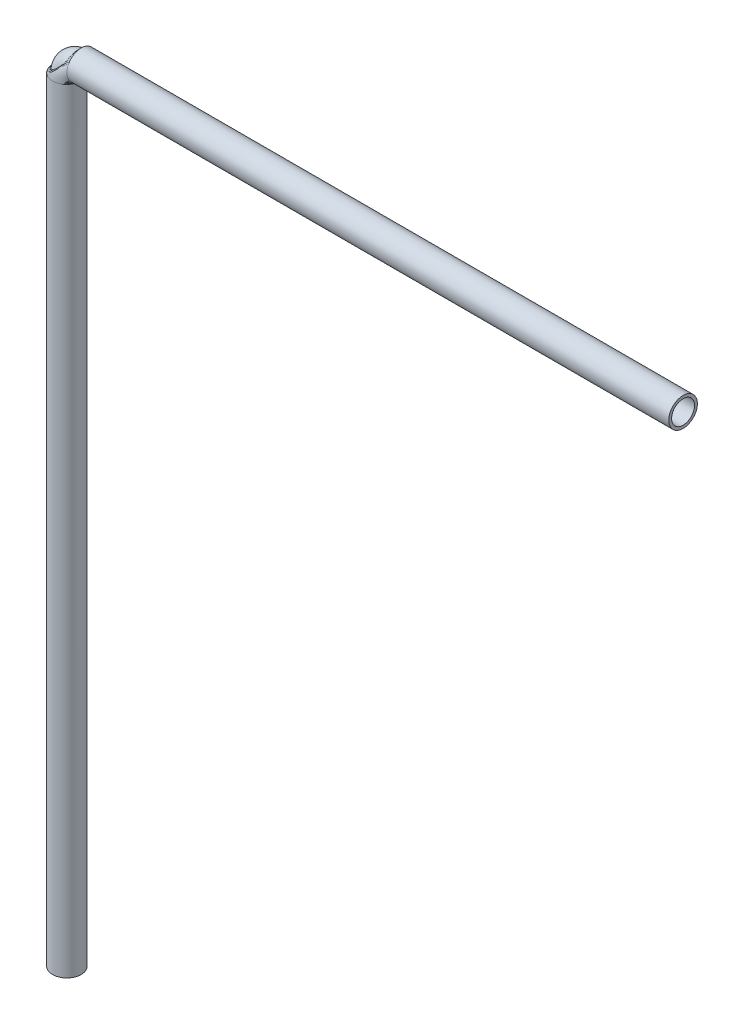
ISO-10303-21;
HEADER;
FILE_DESCRIPTION(('STEP AP214'),'2;1');
FILE_NAME('part.step','',(''),(''),'','','');
FILE_SCHEMA(('AUTOMOTIVE_DESIGN { 1 0 10303 214 1 1 1 1 }'));
ENDSEC;
DATA;
#1=APPLICATION_CONTEXT('core data for automotive mechanical design processes');
#2=APPLICATION_PROTOCOL_DEFINITION('international standard','automotive_design',2000,#1);
#3=PRODUCT_CONTEXT('',#1,'mechanical');
#4=PRODUCT('Part','Part','',(#3));
#5=PRODUCT_RELATED_PRODUCT_CATEGORY('part','',(#4));
#6=PRODUCT_DEFINITION_FORMATION('','',#4);
#7=PRODUCT_DEFINITION_CONTEXT('part definition',#1,'design');
#8=PRODUCT_DEFINITION('design','',#6,#7);
#9=PRODUCT_DEFINITION_SHAPE('','',#8);
#10=(LENGTH_UNIT() NAMED_UNIT(*) SI_UNIT(.MILLI.,.METRE.));
#11=(NAMED_UNIT(*) PLANE_ANGLE_UNIT() SI_UNIT($,.RADIAN.));
#12=(NAMED_UNIT(*) SI_UNIT($,.STERADIAN.) SOLID_ANGLE_UNIT());
#13=UNCERTAINTY_MEASURE_WITH_UNIT(LENGTH_MEASURE(1.E-05),#10,'distance_accuracy_value','');
#14=(GEOMETRIC_REPRESENTATION_CONTEXT(3) GLOBAL_UNCERTAINTY_ASSIGNED_CONTEXT((#13)) GLOBAL_UNIT_ASSIGNED_CONTEXT((#10,
#11,#12)) REPRESENTATION_CONTEXT('',''));
#15=CARTESIAN_POINT('',(0.,0.,0.));
#16=DIRECTION('',(0.,0.,1.));
#17=DIRECTION('',(1.,0.,0.));
#18=AXIS2_PLACEMENT_3D('',#15,#16,#17);
#19=CARTESIAN_POINT('',(0.,0.,0.));
#20=DIRECTION('',(0.,1.,0.));
#21=DIRECTION('',(0.,0.,1.));
#22=AXIS2_PLACEMENT_3D('',#19,#20,#21);
#23=CYLINDRICAL_SURFACE('',#22,0.5);
#24=CARTESIAN_POINT('',(0.,27.,0.));
#25=DIRECTION('',(0.,1.,0.));
#26=DIRECTION('',(0.,0.,1.));
#27=AXIS2_PLACEMENT_3D('',#24,#25,#26);
#28=CIRCLE('',#27,0.5);
#29=CARTESIAN_POINT('',(0.5,27.,0.));
#30=VERTEX_POINT('',#29);
#31=EDGE_CURVE('E65',#30,#30,#28,.T.);
#32=ORIENTED_EDGE('',*,*,#31,.F.);
#33=EDGE_LOOP('',(#32));
#34=FACE_BOUND('',#33,.T.);
#35=CARTESIAN_POINT('',(0.,0.,0.));
#36=DIRECTION('',(0.,1.,0.));
#37=DIRECTION('',(0.,0.,1.));
#38=AXIS2_PLACEMENT_3D('',#35,#36,#37);
#39=CIRCLE('',#38,0.5);
#40=CARTESIAN_POINT('',(0.,0.,0.5));
#41=VERTEX_POINT('',#40);
#42=EDGE_CURVE('E50',#41,#41,#39,.T.);
#43=ORIENTED_EDGE('',*,*,#42,.T.);
#44=EDGE_LOOP('',(#43));
#45=FACE_BOUND('',#44,.T.);
#46=ADVANCED_FACE('F35',(#34,#45),#23,.T.);
#47=CARTESIAN_POINT('',(0.5,27.,0.));
#48=DIRECTION('',(0.,0.,-1.));
#49=DIRECTION('',(-1.,0.,0.));
#50=AXIS2_PLACEMENT_3D('',#47,#48,#49);
#51=TOROIDAL_SURFACE('',#50,0.5,0.5);
#52=CARTESIAN_POINT('',(0.5,27.5,0.));
#53=DIRECTION('',(1.,0.,0.));
#54=DIRECTION('',(0.,0.,1.));
#55=AXIS2_PLACEMENT_3D('',#52,#53,#54);
#56=CIRCLE('',#55,0.5);
#57=EDGE_CURVE('E39',#30,#30,#56,.T.);
#58=ORIENTED_EDGE('',*,*,#57,.F.);
#59=ORIENTED_EDGE('',*,*,#31,.T.);
#60=EDGE_LOOP('',(#58,#59));
#61=FACE_BOUND('',#60,.T.);
#62=ADVANCED_FACE('F91',(#61),#51,.T.);
#63=CARTESIAN_POINT('',(0.5,27.5,0.));
#64=DIRECTION('',(1.,0.,0.));
#65=DIRECTION('',(0.,0.,-1.));
#66=AXIS2_PLACEMENT_3D('',#63,#64,#65);
#67=CYLINDRICAL_SURFACE('',#66,0.5);
#68=CARTESIAN_POINT('',(21.5,27.5,0.));
#69=DIRECTION('',(1.,0.,0.));
#70=DIRECTION('',(0.,0.,1.));
#71=AXIS2_PLACEMENT_3D('',#68,#69,#70);
#72=CIRCLE('',#71,0.5);
#73=CARTESIAN_POINT('',(21.5,27.5,0.5));
#74=VERTEX_POINT('',#73);
#75=EDGE_CURVE('E56',#74,#74,#72,.T.);
#76=ORIENTED_EDGE('',*,*,#75,.F.);
#77=EDGE_LOOP('',(#76));
#78=FACE_BOUND('',#77,.T.);
#79=ORIENTED_EDGE('',*,*,#57,.T.);
#80=EDGE_LOOP('',(#79));
#81=FACE_BOUND('',#80,.T.);
#82=ADVANCED_FACE('F37',(#78,#81),#67,.T.);
#83=CARTESIAN_POINT('',(0.,0.,0.));
#84=DIRECTION('',(0.,1.,0.));
#85=DIRECTION('',(0.,0.,1.));
#86=AXIS2_PLACEMENT_3D('',#83,#84,#85);
#87=PLANE('',#86);
#88=CARTESIAN_POINT('',(0.,0.,0.));
#89=DIRECTION('',(0.,1.,0.));
#90=DIRECTION('',(0.,0.,1.));
#91=AXIS2_PLACEMENT_3D('',#88,#89,#90);
#92=CIRCLE('',#91,0.4);
#93=CARTESIAN_POINT('',(0.,0.,0.4));
#94=VERTEX_POINT('',#93);
#95=EDGE_CURVE('E82',#94,#94,#92,.F.);
#96=ORIENTED_EDGE('',*,*,#95,.F.);
#97=EDGE_LOOP('',(#96));
#98=FACE_BOUND('',#97,.T.);
#99=ORIENTED_EDGE('',*,*,#42,.F.);
#100=EDGE_LOOP('',(#99));
#101=FACE_BOUND('',#100,.T.);
#102=ADVANCED_FACE('F97',(#98,#101),#87,.F.);
#103=CARTESIAN_POINT('',(21.5,27.5,0.));
#104=DIRECTION('',(1.,0.,0.));
#105=DIRECTION('',(0.,0.,1.));
#106=AXIS2_PLACEMENT_3D('',#103,#104,#105);
#107=PLANE('',#106);
#108=CARTESIAN_POINT('',(21.5,27.5,0.));
#109=DIRECTION('',(1.,0.,0.));
#110=DIRECTION('',(0.,0.,1.));
#111=AXIS2_PLACEMENT_3D('',#108,#109,#110);
#112=CIRCLE('',#111,0.4);
#113=CARTESIAN_POINT('',(21.5,27.5,0.4));
#114=VERTEX_POINT('',#113);
#115=EDGE_CURVE('E11',#114,#114,#112,.F.);
#116=ORIENTED_EDGE('',*,*,#115,.T.);
#117=EDGE_LOOP('',(#116));
#118=FACE_BOUND('',#117,.T.);
#119=ORIENTED_EDGE('',*,*,#75,.T.);
#120=EDGE_LOOP('',(#119));
#121=FACE_BOUND('',#120,.T.);
#122=ADVANCED_FACE('F68',(#118,#121),#107,.T.);
#123=CARTESIAN_POINT('',(0.,0.,0.));
#124=DIRECTION('',(0.,1.,0.));
#125=DIRECTION('',(0.,0.,1.));
#126=AXIS2_PLACEMENT_3D('',#123,#124,#125);
#127=CYLINDRICAL_SURFACE('',#126,0.4);
#128=CARTESIAN_POINT('',(0.,27.,0.));
#129=DIRECTION('',(0.,1.,0.));
#130=DIRECTION('',(0.,0.,1.));
#131=AXIS2_PLACEMENT_3D('',#128,#129,#130);
#132=CIRCLE('',#131,0.4);
#133=CARTESIAN_POINT('',(-0.4,27.,0.));
#134=VERTEX_POINT('',#133);
#135=EDGE_CURVE('E79',#134,#134,#132,.F.);
#136=ORIENTED_EDGE('',*,*,#135,.F.);
#137=EDGE_LOOP('',(#136));
#138=FACE_BOUND('',#137,.T.);
#139=ORIENTED_EDGE('',*,*,#95,.T.);
#140=EDGE_LOOP('',(#139));
#141=FACE_BOUND('',#140,.T.);
#142=ADVANCED_FACE('F104',(#138,#141),#127,.F.);
#143=CARTESIAN_POINT('',(0.5,27.,0.));
#144=DIRECTION('',(0.,0.,-1.));
#145=DIRECTION('',(-1.,0.,0.));
#146=AXIS2_PLACEMENT_3D('',#143,#144,#145);
#147=TOROIDAL_SURFACE('',#146,0.5,0.4);
#148=CARTESIAN_POINT('',(0.5,27.5,0.));
#149=DIRECTION('',(1.,0.,0.));
#150=DIRECTION('',(0.,0.,1.));
#151=AXIS2_PLACEMENT_3D('',#148,#149,#150);
#152=CIRCLE('',#151,0.4);
#153=CARTESIAN_POINT('',(0.5,27.9,0.));
#154=VERTEX_POINT('',#153);
#155=EDGE_CURVE('E44',#154,#154,#152,.F.);
#156=CARTESIAN_POINT('',(0.5,27.,0.));
#157=DIRECTION('',(0.,0.,-1.));
#158=DIRECTION('',(-1.,0.,0.));
#159=AXIS2_PLACEMENT_3D('',#156,#157,#158);
#160=CIRCLE('',#159,0.9);
#161=EDGE_CURVE('',#134,#154,#160,.T.);
#162=ORIENTED_EDGE('',*,*,#135,.T.);
#163=ORIENTED_EDGE('',*,*,#155,.F.);
#164=ORIENTED_EDGE('',*,*,#161,.T.);
#165=ORIENTED_EDGE('',*,*,#161,.F.);
#166=EDGE_LOOP('',(#162,#164,#163,#165));
#167=FACE_BOUND('',#166,.T.);
#168=ADVANCED_FACE('F74',(#167),#147,.F.);
#169=CARTESIAN_POINT('',(0.5,27.5,0.));
#170=DIRECTION('',(1.,0.,0.));
#171=DIRECTION('',(0.,0.,-1.));
#172=AXIS2_PLACEMENT_3D('',#169,#170,#171);
#173=CYLINDRICAL_SURFACE('',#172,0.4);
#174=ORIENTED_EDGE('',*,*,#115,.F.);
#175=EDGE_LOOP('',(#174));
#176=FACE_BOUND('',#175,.T.);
#177=ORIENTED_EDGE('',*,*,#155,.T.);
#178=EDGE_LOOP('',(#177));
#179=FACE_BOUND('',#178,.T.);
#180=ADVANCED_FACE('F71',(#176,#179),#173,.F.);
#181=CLOSED_SHELL('',(#46,#62,#82,#102,#122,#142,#168,#180));
#182=MANIFOLD_SOLID_BREP('B2',#181);
#183=ADVANCED_BREP_SHAPE_REPRESENTATION('',(#18,#182),#14);
#184=SHAPE_DEFINITION_REPRESENTATION(#9,#183);
ENDSEC;
END-ISO-10303-21;
